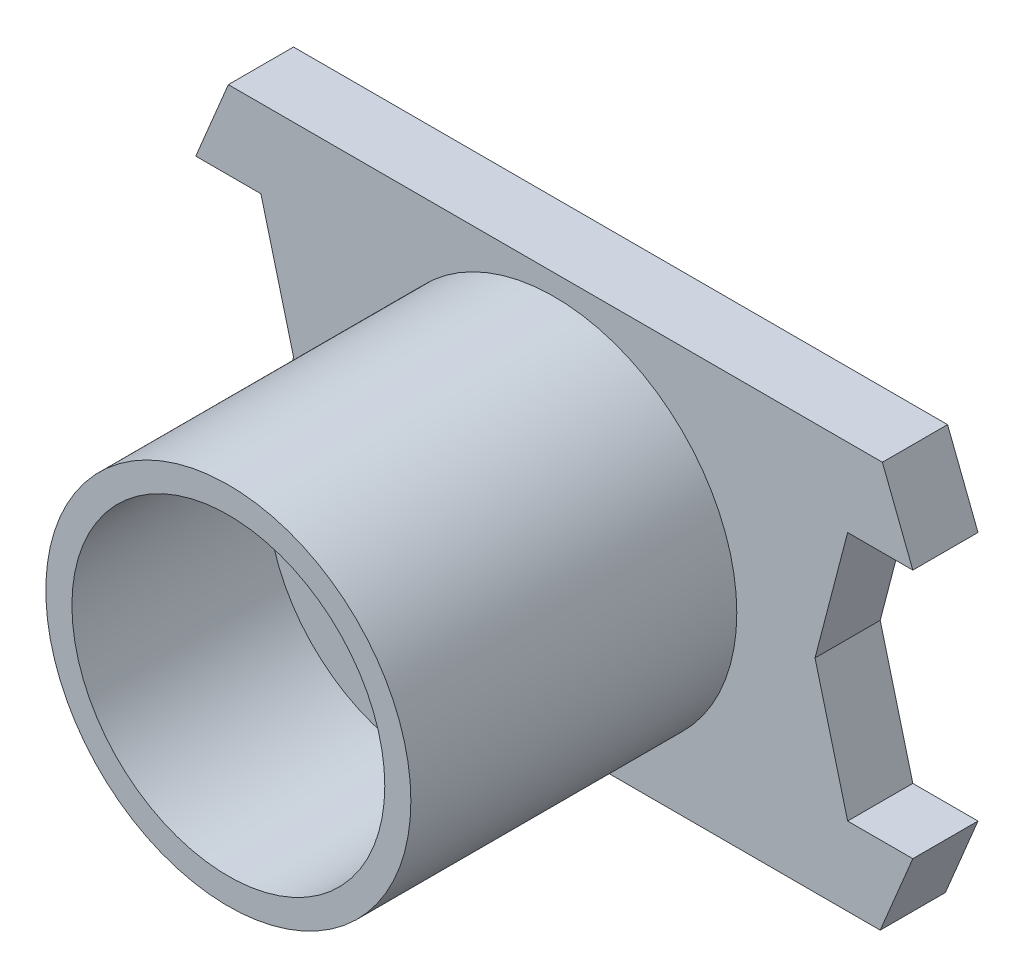
ISO-10303-21;
HEADER;
FILE_DESCRIPTION(('STEP AP214'),'2;1');
FILE_NAME('part.step','',(''),(''),'','','');
FILE_SCHEMA(('AUTOMOTIVE_DESIGN { 1 0 10303 214 1 1 1 1 }'));
ENDSEC;
DATA;
#1=APPLICATION_CONTEXT('core data for automotive mechanical design processes');
#2=APPLICATION_PROTOCOL_DEFINITION('international standard','automotive_design',2000,#1);
#3=PRODUCT_CONTEXT('',#1,'mechanical');
#4=PRODUCT('Part','Part','',(#3));
#5=PRODUCT_RELATED_PRODUCT_CATEGORY('part','',(#4));
#6=PRODUCT_DEFINITION_FORMATION('','',#4);
#7=PRODUCT_DEFINITION_CONTEXT('part definition',#1,'design');
#8=PRODUCT_DEFINITION('design','',#6,#7);
#9=PRODUCT_DEFINITION_SHAPE('','',#8);
#10=(LENGTH_UNIT() NAMED_UNIT(*) SI_UNIT(.MILLI.,.METRE.));
#11=(NAMED_UNIT(*) PLANE_ANGLE_UNIT() SI_UNIT($,.RADIAN.));
#12=(NAMED_UNIT(*) SI_UNIT($,.STERADIAN.) SOLID_ANGLE_UNIT());
#13=UNCERTAINTY_MEASURE_WITH_UNIT(LENGTH_MEASURE(1.E-05),#10,'distance_accuracy_value','');
#14=(GEOMETRIC_REPRESENTATION_CONTEXT(3) GLOBAL_UNCERTAINTY_ASSIGNED_CONTEXT((#13)) GLOBAL_UNIT_ASSIGNED_CONTEXT((#10,
#11,#12)) REPRESENTATION_CONTEXT('',''));
#15=CARTESIAN_POINT('',(0.,0.,0.));
#16=DIRECTION('',(0.,0.,1.));
#17=DIRECTION('',(1.,0.,0.));
#18=AXIS2_PLACEMENT_3D('',#15,#16,#17);
#19=CARTESIAN_POINT('',(0.,19.1666666666666,10.));
#20=DIRECTION('',(0.,1.,0.));
#21=DIRECTION('',(-1.,0.,0.));
#22=AXIS2_PLACEMENT_3D('',#19,#20,#21);
#23=PLANE('',#22);
#24=DIRECTION('',(1.,0.,0.));
#25=VECTOR('',#24,1.);
#26=CARTESIAN_POINT('',(0.,19.1666666666666,0.));
#27=LINE('',#26,#25);
#28=CARTESIAN_POINT('',(45.,19.1666666666667,0.));
#29=VERTEX_POINT('',#28);
#30=CARTESIAN_POINT('',(55.,19.1666666666667,0.));
#31=VERTEX_POINT('',#30);
#32=EDGE_CURVE('E179',#29,#31,#27,.T.);
#33=ORIENTED_EDGE('',*,*,#32,.T.);
#34=DIRECTION('',(0.,0.,-1.));
#35=VECTOR('',#34,1.);
#36=CARTESIAN_POINT('',(55.,19.1666666666667,10.));
#37=LINE('',#36,#35);
#38=CARTESIAN_POINT('',(55.,19.1666666666667,10.));
#39=VERTEX_POINT('',#38);
#40=EDGE_CURVE('E11',#39,#31,#37,.T.);
#41=ORIENTED_EDGE('',*,*,#40,.F.);
#42=DIRECTION('',(1.,0.,0.));
#43=VECTOR('',#42,1.);
#44=CARTESIAN_POINT('',(0.,19.1666666666666,10.));
#45=LINE('',#44,#43);
#46=CARTESIAN_POINT('',(45.,19.1666666666667,10.));
#47=VERTEX_POINT('',#46);
#48=EDGE_CURVE('E227',#47,#39,#45,.T.);
#49=ORIENTED_EDGE('',*,*,#48,.F.);
#50=DIRECTION('',(0.,0.,-1.));
#51=VECTOR('',#50,1.);
#52=CARTESIAN_POINT('',(45.,19.1666666666667,10.));
#53=LINE('',#52,#51);
#54=EDGE_CURVE('E175',#47,#29,#53,.T.);
#55=ORIENTED_EDGE('',*,*,#54,.T.);
#56=EDGE_LOOP('',(#33,#41,#49,#55));
#57=FACE_BOUND('',#56,.T.);
#58=ADVANCED_FACE('F41',(#57),#23,.F.);
#59=CARTESIAN_POINT('',(54.249329758713,21.0969615728333,10.));
#60=DIRECTION('',(-0.932004671541293,-0.362446261154956,0.));
#61=DIRECTION('',(0.362446261154956,-0.932004671541293,0.));
#62=AXIS2_PLACEMENT_3D('',#59,#60,#61);
#63=PLANE('',#62);
#64=DIRECTION('',(-0.362446261154956,0.932004671541293,0.));
#65=VECTOR('',#64,1.);
#66=CARTESIAN_POINT('',(54.249329758713,21.0969615728333,0.));
#67=LINE('',#66,#65);
#68=CARTESIAN_POINT('',(50.3333333333333,31.1666666666667,0.));
#69=VERTEX_POINT('',#68);
#70=EDGE_CURVE('E183',#31,#69,#67,.T.);
#71=ORIENTED_EDGE('',*,*,#70,.T.);
#72=DIRECTION('',(0.,0.,-1.));
#73=VECTOR('',#72,1.);
#74=CARTESIAN_POINT('',(50.3333333333333,31.1666666666667,10.));
#75=LINE('',#74,#73);
#76=CARTESIAN_POINT('',(50.3333333333333,31.1666666666667,10.));
#77=VERTEX_POINT('',#76);
#78=EDGE_CURVE('E51',#77,#69,#75,.T.);
#79=ORIENTED_EDGE('',*,*,#78,.F.);
#80=DIRECTION('',(-0.362446261154956,0.932004671541293,0.));
#81=VECTOR('',#80,1.);
#82=CARTESIAN_POINT('',(54.249329758713,21.0969615728333,10.));
#83=LINE('',#82,#81);
#84=EDGE_CURVE('E120',#39,#77,#83,.T.);
#85=ORIENTED_EDGE('',*,*,#84,.F.);
#86=ORIENTED_EDGE('',*,*,#40,.T.);
#87=EDGE_LOOP('',(#71,#79,#85,#86));
#88=FACE_BOUND('',#87,.T.);
#89=ADVANCED_FACE('F267',(#88),#63,.F.);
#90=CARTESIAN_POINT('',(0.,31.1666666666667,10.));
#91=DIRECTION('',(0.,1.,0.));
#92=DIRECTION('',(0.,0.,1.));
#93=AXIS2_PLACEMENT_3D('',#90,#91,#92);
#94=PLANE('',#93);
#95=DIRECTION('',(1.,0.,0.));
#96=VECTOR('',#95,1.);
#97=CARTESIAN_POINT('',(0.,31.1666666666667,0.));
#98=LINE('',#97,#96);
#99=CARTESIAN_POINT('',(-50.,31.1666666666667,0.));
#100=VERTEX_POINT('',#99);
#101=EDGE_CURVE('E188',#100,#69,#98,.T.);
#102=ORIENTED_EDGE('',*,*,#101,.F.);
#103=DIRECTION('',(0.,0.,-1.));
#104=VECTOR('',#103,1.);
#105=CARTESIAN_POINT('',(-50.,31.1666666666667,10.));
#106=LINE('',#105,#104);
#107=CARTESIAN_POINT('',(-50.,31.1666666666667,10.));
#108=VERTEX_POINT('',#107);
#109=EDGE_CURVE('E257',#108,#100,#106,.T.);
#110=ORIENTED_EDGE('',*,*,#109,.F.);
#111=DIRECTION('',(1.,0.,0.));
#112=VECTOR('',#111,1.);
#113=CARTESIAN_POINT('',(0.,31.1666666666667,10.));
#114=LINE('',#113,#112);
#115=EDGE_CURVE('E266',#108,#77,#114,.T.);
#116=ORIENTED_EDGE('',*,*,#115,.T.);
#117=ORIENTED_EDGE('',*,*,#78,.T.);
#118=EDGE_LOOP('',(#102,#110,#116,#117));
#119=FACE_BOUND('',#118,.T.);
#120=ADVANCED_FACE('F264',(#119),#94,.T.);
#121=CARTESIAN_POINT('',(-53.6686390532544,22.361932938856,10.));
#122=DIRECTION('',(-0.923076923076923,0.384615384615385,0.));
#123=DIRECTION('',(-0.384615384615385,-0.923076923076923,0.));
#124=AXIS2_PLACEMENT_3D('',#121,#122,#123);
#125=PLANE('',#124);
#126=DIRECTION('',(0.384615384615385,0.923076923076923,0.));
#127=VECTOR('',#126,1.);
#128=CARTESIAN_POINT('',(-53.6686390532544,22.361932938856,0.));
#129=LINE('',#128,#127);
#130=CARTESIAN_POINT('',(-55.,19.1666666666667,0.));
#131=VERTEX_POINT('',#130);
#132=EDGE_CURVE('E192',#131,#100,#129,.T.);
#133=ORIENTED_EDGE('',*,*,#132,.F.);
#134=DIRECTION('',(0.,0.,-1.));
#135=VECTOR('',#134,1.);
#136=CARTESIAN_POINT('',(-55.,19.1666666666667,10.));
#137=LINE('',#136,#135);
#138=CARTESIAN_POINT('',(-55.,19.1666666666667,10.));
#139=VERTEX_POINT('',#138);
#140=EDGE_CURVE('E254',#139,#131,#137,.T.);
#141=ORIENTED_EDGE('',*,*,#140,.F.);
#142=DIRECTION('',(0.384615384615385,0.923076923076923,0.));
#143=VECTOR('',#142,1.);
#144=CARTESIAN_POINT('',(-53.6686390532544,22.361932938856,10.));
#145=LINE('',#144,#143);
#146=EDGE_CURVE('E278',#139,#108,#145,.T.);
#147=ORIENTED_EDGE('',*,*,#146,.T.);
#148=ORIENTED_EDGE('',*,*,#109,.T.);
#149=EDGE_LOOP('',(#133,#141,#147,#148));
#150=FACE_BOUND('',#149,.T.);
#151=ADVANCED_FACE('F275',(#150),#125,.T.);
#152=CARTESIAN_POINT('',(0.,19.1666666666667,10.));
#153=DIRECTION('',(0.,-1.,0.));
#154=DIRECTION('',(0.,0.,-1.));
#155=AXIS2_PLACEMENT_3D('',#152,#153,#154);
#156=PLANE('',#155);
#157=DIRECTION('',(-1.,0.,0.));
#158=VECTOR('',#157,1.);
#159=CARTESIAN_POINT('',(0.,19.1666666666667,0.));
#160=LINE('',#159,#158);
#161=CARTESIAN_POINT('',(-45.,19.1666666666667,0.));
#162=VERTEX_POINT('',#161);
#163=EDGE_CURVE('E196',#162,#131,#160,.T.);
#164=ORIENTED_EDGE('',*,*,#163,.F.);
#165=DIRECTION('',(0.,0.,-1.));
#166=VECTOR('',#165,1.);
#167=CARTESIAN_POINT('',(-45.,19.1666666666667,10.));
#168=LINE('',#167,#166);
#169=CARTESIAN_POINT('',(-45.,19.1666666666667,10.));
#170=VERTEX_POINT('',#169);
#171=EDGE_CURVE('E251',#170,#162,#168,.T.);
#172=ORIENTED_EDGE('',*,*,#171,.F.);
#173=DIRECTION('',(-1.,0.,0.));
#174=VECTOR('',#173,1.);
#175=CARTESIAN_POINT('',(0.,19.1666666666667,10.));
#176=LINE('',#175,#174);
#177=EDGE_CURVE('E285',#170,#139,#176,.T.);
#178=ORIENTED_EDGE('',*,*,#177,.T.);
#179=ORIENTED_EDGE('',*,*,#140,.T.);
#180=EDGE_LOOP('',(#164,#172,#178,#179));
#181=FACE_BOUND('',#180,.T.);
#182=ADVANCED_FACE('F345',(#181),#156,.T.);
#183=CARTESIAN_POINT('',(-37.4513274336283,-9.76991150442478,10.));
#184=DIRECTION('',(-0.967617272396844,-0.252421897147003,0.));
#185=DIRECTION('',(0.252421897147003,-0.967617272396844,0.));
#186=AXIS2_PLACEMENT_3D('',#183,#184,#185);
#187=PLANE('',#186);
#188=DIRECTION('',(-0.252421897147003,0.967617272396844,0.));
#189=VECTOR('',#188,1.);
#190=CARTESIAN_POINT('',(-37.4513274336283,-9.76991150442478,0.));
#191=LINE('',#190,#189);
#192=CARTESIAN_POINT('',(-40.,0.,0.));
#193=VERTEX_POINT('',#192);
#194=EDGE_CURVE('E200',#193,#162,#191,.T.);
#195=ORIENTED_EDGE('',*,*,#194,.F.);
#196=DIRECTION('',(0.,0.,-1.));
#197=VECTOR('',#196,1.);
#198=CARTESIAN_POINT('',(-40.,0.,10.));
#199=LINE('',#198,#197);
#200=CARTESIAN_POINT('',(-40.,0.,10.));
#201=VERTEX_POINT('',#200);
#202=EDGE_CURVE('E248',#201,#193,#199,.T.);
#203=ORIENTED_EDGE('',*,*,#202,.F.);
#204=DIRECTION('',(-0.252421897147003,0.967617272396844,0.));
#205=VECTOR('',#204,1.);
#206=CARTESIAN_POINT('',(-37.4513274336283,-9.76991150442478,10.));
#207=LINE('',#206,#205);
#208=EDGE_CURVE('E292',#201,#170,#207,.T.);
#209=ORIENTED_EDGE('',*,*,#208,.T.);
#210=ORIENTED_EDGE('',*,*,#171,.T.);
#211=EDGE_LOOP('',(#195,#203,#209,#210));
#212=FACE_BOUND('',#211,.T.);
#213=ADVANCED_FACE('F348',(#212),#187,.T.);
#214=CARTESIAN_POINT('',(-37.4513274336283,9.76991150442478,10.));
#215=DIRECTION('',(-0.967617272396844,0.252421897147003,0.));
#216=DIRECTION('',(-0.252421897147003,-0.967617272396844,0.));
#217=AXIS2_PLACEMENT_3D('',#214,#215,#216);
#218=PLANE('',#217);
#219=DIRECTION('',(0.252421897147003,0.967617272396844,0.));
#220=VECTOR('',#219,1.);
#221=CARTESIAN_POINT('',(-37.4513274336283,9.76991150442478,0.));
#222=LINE('',#221,#220);
#223=CARTESIAN_POINT('',(-45.,-19.1666666666667,0.));
#224=VERTEX_POINT('',#223);
#225=EDGE_CURVE('E204',#224,#193,#222,.T.);
#226=ORIENTED_EDGE('',*,*,#225,.F.);
#227=DIRECTION('',(0.,0.,-1.));
#228=VECTOR('',#227,1.);
#229=CARTESIAN_POINT('',(-45.,-19.1666666666667,10.));
#230=LINE('',#229,#228);
#231=CARTESIAN_POINT('',(-45.,-19.1666666666667,10.));
#232=VERTEX_POINT('',#231);
#233=EDGE_CURVE('E245',#232,#224,#230,.T.);
#234=ORIENTED_EDGE('',*,*,#233,.F.);
#235=DIRECTION('',(0.252421897147003,0.967617272396844,0.));
#236=VECTOR('',#235,1.);
#237=CARTESIAN_POINT('',(-37.4513274336283,9.76991150442478,10.));
#238=LINE('',#237,#236);
#239=EDGE_CURVE('E296',#232,#201,#238,.T.);
#240=ORIENTED_EDGE('',*,*,#239,.T.);
#241=ORIENTED_EDGE('',*,*,#202,.T.);
#242=EDGE_LOOP('',(#226,#234,#240,#241));
#243=FACE_BOUND('',#242,.T.);
#244=ADVANCED_FACE('F352',(#243),#218,.T.);
#245=CARTESIAN_POINT('',(0.,-19.1666666666666,10.));
#246=DIRECTION('',(0.,1.,0.));
#247=DIRECTION('',(-1.,0.,0.));
#248=AXIS2_PLACEMENT_3D('',#245,#246,#247);
#249=PLANE('',#248);
#250=DIRECTION('',(1.,0.,0.));
#251=VECTOR('',#250,1.);
#252=CARTESIAN_POINT('',(0.,-19.1666666666666,0.));
#253=LINE('',#252,#251);
#254=CARTESIAN_POINT('',(-55.,-19.1666666666667,0.));
#255=VERTEX_POINT('',#254);
#256=EDGE_CURVE('E208',#255,#224,#253,.T.);
#257=ORIENTED_EDGE('',*,*,#256,.F.);
#258=DIRECTION('',(0.,0.,-1.));
#259=VECTOR('',#258,1.);
#260=CARTESIAN_POINT('',(-55.,-19.1666666666667,10.));
#261=LINE('',#260,#259);
#262=CARTESIAN_POINT('',(-55.,-19.1666666666667,10.));
#263=VERTEX_POINT('',#262);
#264=EDGE_CURVE('E242',#263,#255,#261,.T.);
#265=ORIENTED_EDGE('',*,*,#264,.F.);
#266=DIRECTION('',(1.,0.,0.));
#267=VECTOR('',#266,1.);
#268=CARTESIAN_POINT('',(0.,-19.1666666666666,10.));
#269=LINE('',#268,#267);
#270=EDGE_CURVE('E300',#263,#232,#269,.T.);
#271=ORIENTED_EDGE('',*,*,#270,.T.);
#272=ORIENTED_EDGE('',*,*,#233,.T.);
#273=EDGE_LOOP('',(#257,#265,#271,#272));
#274=FACE_BOUND('',#273,.T.);
#275=ADVANCED_FACE('F356',(#274),#249,.T.);
#276=CARTESIAN_POINT('',(-53.6686390532544,-22.361932938856,10.));
#277=DIRECTION('',(0.923076923076923,0.384615384615385,0.));
#278=DIRECTION('',(-0.384615384615385,0.923076923076923,0.));
#279=AXIS2_PLACEMENT_3D('',#276,#277,#278);
#280=PLANE('',#279);
#281=DIRECTION('',(0.384615384615385,-0.923076923076923,0.));
#282=VECTOR('',#281,1.);
#283=CARTESIAN_POINT('',(-53.6686390532544,-22.361932938856,0.));
#284=LINE('',#283,#282);
#285=CARTESIAN_POINT('',(-50.,-31.1666666666667,0.));
#286=VERTEX_POINT('',#285);
#287=EDGE_CURVE('E212',#255,#286,#284,.T.);
#288=ORIENTED_EDGE('',*,*,#287,.T.);
#289=DIRECTION('',(0.,0.,-1.));
#290=VECTOR('',#289,1.);
#291=CARTESIAN_POINT('',(-50.,-31.1666666666667,10.));
#292=LINE('',#291,#290);
#293=CARTESIAN_POINT('',(-50.,-31.1666666666667,10.));
#294=VERTEX_POINT('',#293);
#295=EDGE_CURVE('E238',#294,#286,#292,.T.);
#296=ORIENTED_EDGE('',*,*,#295,.F.);
#297=DIRECTION('',(0.384615384615385,-0.923076923076923,0.));
#298=VECTOR('',#297,1.);
#299=CARTESIAN_POINT('',(-53.6686390532544,-22.361932938856,10.));
#300=LINE('',#299,#298);
#301=EDGE_CURVE('E304',#263,#294,#300,.T.);
#302=ORIENTED_EDGE('',*,*,#301,.F.);
#303=ORIENTED_EDGE('',*,*,#264,.T.);
#304=EDGE_LOOP('',(#288,#296,#302,#303));
#305=FACE_BOUND('',#304,.T.);
#306=ADVANCED_FACE('F360',(#305),#280,.F.);
#307=CARTESIAN_POINT('',(0.,-31.1666666666667,10.));
#308=DIRECTION('',(0.,1.,0.));
#309=DIRECTION('',(0.,0.,1.));
#310=AXIS2_PLACEMENT_3D('',#307,#308,#309);
#311=PLANE('',#310);
#312=DIRECTION('',(1.,0.,0.));
#313=VECTOR('',#312,1.);
#314=CARTESIAN_POINT('',(0.,-31.1666666666667,0.));
#315=LINE('',#314,#313);
#316=CARTESIAN_POINT('',(50.,-31.1666666666667,0.));
#317=VERTEX_POINT('',#316);
#318=EDGE_CURVE('E215',#286,#317,#315,.T.);
#319=ORIENTED_EDGE('',*,*,#318,.T.);
#320=DIRECTION('',(0.,0.,-1.));
#321=VECTOR('',#320,1.);
#322=CARTESIAN_POINT('',(50.,-31.1666666666667,10.));
#323=LINE('',#322,#321);
#324=CARTESIAN_POINT('',(50.,-31.1666666666667,10.));
#325=VERTEX_POINT('',#324);
#326=EDGE_CURVE('E234',#325,#317,#323,.T.);
#327=ORIENTED_EDGE('',*,*,#326,.F.);
#328=DIRECTION('',(1.,0.,0.));
#329=VECTOR('',#328,1.);
#330=CARTESIAN_POINT('',(0.,-31.1666666666667,10.));
#331=LINE('',#330,#329);
#332=EDGE_CURVE('E307',#294,#325,#331,.T.);
#333=ORIENTED_EDGE('',*,*,#332,.F.);
#334=ORIENTED_EDGE('',*,*,#295,.T.);
#335=EDGE_LOOP('',(#319,#327,#333,#334));
#336=FACE_BOUND('',#335,.T.);
#337=ADVANCED_FACE('F316',(#336),#311,.F.);
#338=CARTESIAN_POINT('',(53.6686390532544,-22.361932938856,10.));
#339=DIRECTION('',(-0.923076923076923,0.384615384615385,0.));
#340=DIRECTION('',(-0.384615384615385,-0.923076923076923,0.));
#341=AXIS2_PLACEMENT_3D('',#338,#339,#340);
#342=PLANE('',#341);
#343=DIRECTION('',(0.384615384615385,0.923076923076923,0.));
#344=VECTOR('',#343,1.);
#345=CARTESIAN_POINT('',(53.6686390532544,-22.361932938856,0.));
#346=LINE('',#345,#344);
#347=CARTESIAN_POINT('',(55.,-19.1666666666667,0.));
#348=VERTEX_POINT('',#347);
#349=EDGE_CURVE('E218',#317,#348,#346,.T.);
#350=ORIENTED_EDGE('',*,*,#349,.T.);
#351=DIRECTION('',(0.,0.,-1.));
#352=VECTOR('',#351,1.);
#353=CARTESIAN_POINT('',(55.,-19.1666666666667,10.));
#354=LINE('',#353,#352);
#355=CARTESIAN_POINT('',(55.,-19.1666666666667,10.));
#356=VERTEX_POINT('',#355);
#357=EDGE_CURVE('E168',#356,#348,#354,.T.);
#358=ORIENTED_EDGE('',*,*,#357,.F.);
#359=DIRECTION('',(0.384615384615385,0.923076923076923,0.));
#360=VECTOR('',#359,1.);
#361=CARTESIAN_POINT('',(53.6686390532544,-22.361932938856,10.));
#362=LINE('',#361,#360);
#363=EDGE_CURVE('E157',#325,#356,#362,.T.);
#364=ORIENTED_EDGE('',*,*,#363,.F.);
#365=ORIENTED_EDGE('',*,*,#326,.T.);
#366=EDGE_LOOP('',(#350,#358,#364,#365));
#367=FACE_BOUND('',#366,.T.);
#368=ADVANCED_FACE('F320',(#367),#342,.F.);
#369=CARTESIAN_POINT('',(0.,-19.1666666666667,10.));
#370=DIRECTION('',(0.,-1.,0.));
#371=DIRECTION('',(0.,0.,-1.));
#372=AXIS2_PLACEMENT_3D('',#369,#370,#371);
#373=PLANE('',#372);
#374=DIRECTION('',(-1.,0.,0.));
#375=VECTOR('',#374,1.);
#376=CARTESIAN_POINT('',(0.,-19.1666666666667,0.));
#377=LINE('',#376,#375);
#378=CARTESIAN_POINT('',(45.,-19.1666666666667,0.));
#379=VERTEX_POINT('',#378);
#380=EDGE_CURVE('E166',#348,#379,#377,.T.);
#381=ORIENTED_EDGE('',*,*,#380,.T.);
#382=DIRECTION('',(0.,0.,-1.));
#383=VECTOR('',#382,1.);
#384=CARTESIAN_POINT('',(45.,-19.1666666666667,10.));
#385=LINE('',#384,#383);
#386=CARTESIAN_POINT('',(45.,-19.1666666666667,10.));
#387=VERTEX_POINT('',#386);
#388=EDGE_CURVE('E163',#387,#379,#385,.T.);
#389=ORIENTED_EDGE('',*,*,#388,.F.);
#390=DIRECTION('',(-1.,0.,0.));
#391=VECTOR('',#390,1.);
#392=CARTESIAN_POINT('',(0.,-19.1666666666667,10.));
#393=LINE('',#392,#391);
#394=EDGE_CURVE('E151',#356,#387,#393,.T.);
#395=ORIENTED_EDGE('',*,*,#394,.F.);
#396=ORIENTED_EDGE('',*,*,#357,.T.);
#397=EDGE_LOOP('',(#381,#389,#395,#396));
#398=FACE_BOUND('',#397,.T.);
#399=ADVANCED_FACE('F164',(#398),#373,.F.);
#400=CARTESIAN_POINT('',(37.4513274336283,9.76991150442478,10.));
#401=DIRECTION('',(-0.967617272396844,-0.252421897147003,0.));
#402=DIRECTION('',(0.252421897147003,-0.967617272396844,0.));
#403=AXIS2_PLACEMENT_3D('',#400,#401,#402);
#404=PLANE('',#403);
#405=DIRECTION('',(-0.252421897147003,0.967617272396844,0.));
#406=VECTOR('',#405,1.);
#407=CARTESIAN_POINT('',(37.4513274336283,9.76991150442478,0.));
#408=LINE('',#407,#406);
#409=CARTESIAN_POINT('',(40.,0.,0.));
#410=VERTEX_POINT('',#409);
#411=EDGE_CURVE('E106',#379,#410,#408,.T.);
#412=ORIENTED_EDGE('',*,*,#411,.T.);
#413=DIRECTION('',(0.,0.,-1.));
#414=VECTOR('',#413,1.);
#415=CARTESIAN_POINT('',(40.,0.,10.));
#416=LINE('',#415,#414);
#417=CARTESIAN_POINT('',(40.,0.,10.));
#418=VERTEX_POINT('',#417);
#419=EDGE_CURVE('E169',#418,#410,#416,.T.);
#420=ORIENTED_EDGE('',*,*,#419,.F.);
#421=DIRECTION('',(-0.252421897147003,0.967617272396844,0.));
#422=VECTOR('',#421,1.);
#423=CARTESIAN_POINT('',(37.4513274336283,9.76991150442478,10.));
#424=LINE('',#423,#422);
#425=EDGE_CURVE('E155',#387,#418,#424,.T.);
#426=ORIENTED_EDGE('',*,*,#425,.F.);
#427=ORIENTED_EDGE('',*,*,#388,.T.);
#428=EDGE_LOOP('',(#412,#420,#426,#427));
#429=FACE_BOUND('',#428,.T.);
#430=ADVANCED_FACE('F171',(#429),#404,.F.);
#431=CARTESIAN_POINT('',(37.4513274336283,-9.76991150442478,10.));
#432=DIRECTION('',(-0.967617272396844,0.252421897147003,0.));
#433=DIRECTION('',(-0.252421897147003,-0.967617272396844,0.));
#434=AXIS2_PLACEMENT_3D('',#431,#432,#433);
#435=PLANE('',#434);
#436=DIRECTION('',(0.252421897147003,0.967617272396844,0.));
#437=VECTOR('',#436,1.);
#438=CARTESIAN_POINT('',(37.4513274336283,-9.76991150442478,0.));
#439=LINE('',#438,#437);
#440=EDGE_CURVE('E112',#410,#29,#439,.T.);
#441=ORIENTED_EDGE('',*,*,#440,.T.);
#442=ORIENTED_EDGE('',*,*,#54,.F.);
#443=DIRECTION('',(0.252421897147003,0.967617272396844,0.));
#444=VECTOR('',#443,1.);
#445=CARTESIAN_POINT('',(37.4513274336283,-9.76991150442478,10.));
#446=LINE('',#445,#444);
#447=EDGE_CURVE('E59',#418,#47,#446,.T.);
#448=ORIENTED_EDGE('',*,*,#447,.F.);
#449=ORIENTED_EDGE('',*,*,#419,.T.);
#450=EDGE_LOOP('',(#441,#442,#448,#449));
#451=FACE_BOUND('',#450,.T.);
#452=ADVANCED_FACE('F323',(#451),#435,.F.);
#453=CARTESIAN_POINT('',(0.,0.,10.));
#454=DIRECTION('',(0.,0.,1.));
#455=DIRECTION('',(1.,0.,0.));
#456=AXIS2_PLACEMENT_3D('',#453,#454,#455);
#457=PLANE('',#456);
#458=CARTESIAN_POINT('',(0.,0.,10.));
#459=DIRECTION('',(0.,0.,1.));
#460=DIRECTION('',(1.,0.,0.));
#461=AXIS2_PLACEMENT_3D('',#458,#459,#460);
#462=CIRCLE('',#461,28.);
#463=CARTESIAN_POINT('',(28.,0.,10.));
#464=VERTEX_POINT('',#463);
#465=EDGE_CURVE('E467',#464,#464,#462,.T.);
#466=ORIENTED_EDGE('',*,*,#465,.F.);
#467=EDGE_LOOP('',(#466));
#468=FACE_BOUND('',#467,.T.);
#469=ORIENTED_EDGE('',*,*,#48,.T.);
#470=ORIENTED_EDGE('',*,*,#84,.T.);
#471=ORIENTED_EDGE('',*,*,#115,.F.);
#472=ORIENTED_EDGE('',*,*,#146,.F.);
#473=ORIENTED_EDGE('',*,*,#177,.F.);
#474=ORIENTED_EDGE('',*,*,#208,.F.);
#475=ORIENTED_EDGE('',*,*,#239,.F.);
#476=ORIENTED_EDGE('',*,*,#270,.F.);
#477=ORIENTED_EDGE('',*,*,#301,.T.);
#478=ORIENTED_EDGE('',*,*,#332,.T.);
#479=ORIENTED_EDGE('',*,*,#363,.T.);
#480=ORIENTED_EDGE('',*,*,#394,.T.);
#481=ORIENTED_EDGE('',*,*,#425,.T.);
#482=ORIENTED_EDGE('',*,*,#447,.T.);
#483=EDGE_LOOP('',(#469,#470,#471,#472,#473,#474,#475,#476,#477,#478,#479,#480,#481,#482));
#484=FACE_BOUND('',#483,.T.);
#485=ADVANCED_FACE('F153',(#468,#484),#457,.T.);
#486=CARTESIAN_POINT('',(0.,0.,0.));
#487=DIRECTION('',(0.,0.,1.));
#488=DIRECTION('',(1.,0.,0.));
#489=AXIS2_PLACEMENT_3D('',#486,#487,#488);
#490=PLANE('',#489);
#491=CARTESIAN_POINT('',(0.,0.,0.));
#492=DIRECTION('',(0.,0.,1.));
#493=DIRECTION('',(1.,0.,0.));
#494=AXIS2_PLACEMENT_3D('',#491,#492,#493);
#495=CIRCLE('',#494,10.);
#496=CARTESIAN_POINT('',(10.,0.,0.));
#497=VERTEX_POINT('',#496);
#498=EDGE_CURVE('E44',#497,#497,#495,.T.);
#499=ORIENTED_EDGE('',*,*,#498,.T.);
#500=EDGE_LOOP('',(#499));
#501=FACE_BOUND('',#500,.T.);
#502=ORIENTED_EDGE('',*,*,#32,.F.);
#503=ORIENTED_EDGE('',*,*,#440,.F.);
#504=ORIENTED_EDGE('',*,*,#411,.F.);
#505=ORIENTED_EDGE('',*,*,#380,.F.);
#506=ORIENTED_EDGE('',*,*,#349,.F.);
#507=ORIENTED_EDGE('',*,*,#318,.F.);
#508=ORIENTED_EDGE('',*,*,#287,.F.);
#509=ORIENTED_EDGE('',*,*,#256,.T.);
#510=ORIENTED_EDGE('',*,*,#225,.T.);
#511=ORIENTED_EDGE('',*,*,#194,.T.);
#512=ORIENTED_EDGE('',*,*,#163,.T.);
#513=ORIENTED_EDGE('',*,*,#132,.T.);
#514=ORIENTED_EDGE('',*,*,#101,.T.);
#515=ORIENTED_EDGE('',*,*,#70,.F.);
#516=EDGE_LOOP('',(#502,#503,#504,#505,#506,#507,#508,#509,#510,#511,#512,#513,#514,#515));
#517=FACE_BOUND('',#516,.T.);
#518=ADVANCED_FACE('F271',(#501,#517),#490,.F.);
#519=CARTESIAN_POINT('',(0.,0.,60.));
#520=DIRECTION('',(0.,0.,-1.));
#521=DIRECTION('',(-1.,0.,0.));
#522=AXIS2_PLACEMENT_3D('',#519,#520,#521);
#523=CYLINDRICAL_SURFACE('',#522,28.);
#524=CARTESIAN_POINT('',(0.,0.,60.));
#525=DIRECTION('',(0.,0.,1.));
#526=DIRECTION('',(1.,0.,0.));
#527=AXIS2_PLACEMENT_3D('',#524,#525,#526);
#528=CIRCLE('',#527,28.);
#529=CARTESIAN_POINT('',(28.,0.,60.));
#530=VERTEX_POINT('',#529);
#531=EDGE_CURVE('E184',#530,#530,#528,.T.);
#532=ORIENTED_EDGE('',*,*,#531,.F.);
#533=EDGE_LOOP('',(#532));
#534=FACE_BOUND('',#533,.T.);
#535=ORIENTED_EDGE('',*,*,#465,.T.);
#536=EDGE_LOOP('',(#535));
#537=FACE_BOUND('',#536,.T.);
#538=ADVANCED_FACE('F395',(#534,#537),#523,.T.);
#539=CARTESIAN_POINT('',(0.,0.,60.));
#540=DIRECTION('',(0.,0.,1.));
#541=DIRECTION('',(1.,0.,0.));
#542=AXIS2_PLACEMENT_3D('',#539,#540,#541);
#543=PLANE('',#542);
#544=CARTESIAN_POINT('',(0.,0.,60.));
#545=DIRECTION('',(0.,0.,1.));
#546=DIRECTION('',(1.,0.,0.));
#547=AXIS2_PLACEMENT_3D('',#544,#545,#546);
#548=CIRCLE('',#547,24.);
#549=CARTESIAN_POINT('',(24.,0.,60.));
#550=VERTEX_POINT('',#549);
#551=EDGE_CURVE('E457',#550,#550,#548,.T.);
#552=ORIENTED_EDGE('',*,*,#551,.F.);
#553=EDGE_LOOP('',(#552));
#554=FACE_BOUND('',#553,.T.);
#555=ORIENTED_EDGE('',*,*,#531,.T.);
#556=EDGE_LOOP('',(#555));
#557=FACE_BOUND('',#556,.T.);
#558=ADVANCED_FACE('F400',(#554,#557),#543,.T.);
#559=CARTESIAN_POINT('',(0.,0.,30.));
#560=DIRECTION('',(0.,0.,1.));
#561=DIRECTION('',(1.,0.,0.));
#562=AXIS2_PLACEMENT_3D('',#559,#560,#561);
#563=CYLINDRICAL_SURFACE('',#562,24.);
#564=CARTESIAN_POINT('',(0.,0.,30.));
#565=DIRECTION('',(0.,0.,1.));
#566=DIRECTION('',(1.,0.,0.));
#567=AXIS2_PLACEMENT_3D('',#564,#565,#566);
#568=CIRCLE('',#567,24.);
#569=CARTESIAN_POINT('',(24.,0.,30.));
#570=VERTEX_POINT('',#569);
#571=EDGE_CURVE('E461',#570,#570,#568,.T.);
#572=ORIENTED_EDGE('',*,*,#571,.F.);
#573=EDGE_LOOP('',(#572));
#574=FACE_BOUND('',#573,.T.);
#575=ORIENTED_EDGE('',*,*,#551,.T.);
#576=EDGE_LOOP('',(#575));
#577=FACE_BOUND('',#576,.T.);
#578=ADVANCED_FACE('F410',(#574,#577),#563,.F.);
#579=CARTESIAN_POINT('',(0.,0.,30.));
#580=DIRECTION('',(0.,0.,1.));
#581=DIRECTION('',(1.,0.,0.));
#582=AXIS2_PLACEMENT_3D('',#579,#580,#581);
#583=PLANE('',#582);
#584=CARTESIAN_POINT('',(0.,0.,30.));
#585=DIRECTION('',(0.,0.,1.));
#586=DIRECTION('',(1.,0.,0.));
#587=AXIS2_PLACEMENT_3D('',#584,#585,#586);
#588=CIRCLE('',#587,10.);
#589=CARTESIAN_POINT('',(10.,0.,30.));
#590=VERTEX_POINT('',#589);
#591=EDGE_CURVE('E453',#590,#590,#588,.T.);
#592=ORIENTED_EDGE('',*,*,#591,.F.);
#593=EDGE_LOOP('',(#592));
#594=FACE_BOUND('',#593,.T.);
#595=ORIENTED_EDGE('',*,*,#571,.T.);
#596=EDGE_LOOP('',(#595));
#597=FACE_BOUND('',#596,.T.);
#598=ADVANCED_FACE('F420',(#594,#597),#583,.T.);
#599=CARTESIAN_POINT('',(0.,0.,-30.));
#600=DIRECTION('',(0.,0.,1.));
#601=DIRECTION('',(1.,0.,0.));
#602=AXIS2_PLACEMENT_3D('',#599,#600,#601);
#603=CYLINDRICAL_SURFACE('',#602,10.);
#604=ORIENTED_EDGE('',*,*,#591,.T.);
#605=EDGE_LOOP('',(#604));
#606=FACE_BOUND('',#605,.T.);
#607=ORIENTED_EDGE('',*,*,#498,.F.);
#608=EDGE_LOOP('',(#607));
#609=FACE_BOUND('',#608,.T.);
#610=ADVANCED_FACE('F436',(#606,#609),#603,.F.);
#611=CLOSED_SHELL('',(#58,#89,#120,#151,#182,#213,#244,#275,#306,#337,#368,#399,#430,#452,#485,
#518,#538,#558,#578,#598,#610));
#612=MANIFOLD_SOLID_BREP('B2',#611);
#613=ADVANCED_BREP_SHAPE_REPRESENTATION('',(#18,#612),#14);
#614=SHAPE_DEFINITION_REPRESENTATION(#9,#613);
ENDSEC;
END-ISO-10303-21;
